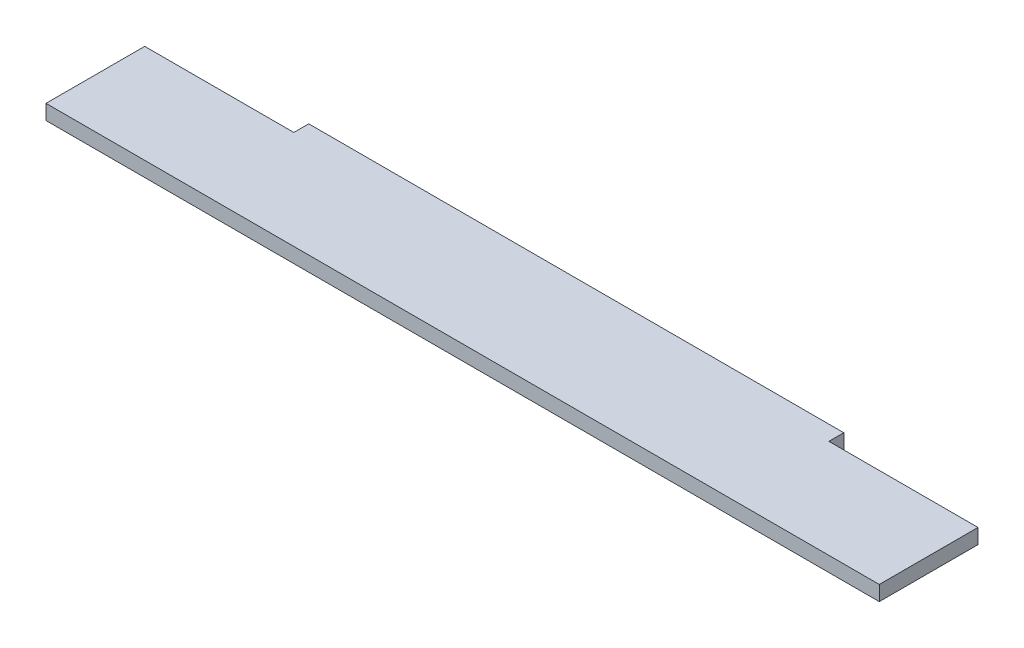
ISO-10303-21;
HEADER;
FILE_DESCRIPTION(('STEP AP214'),'2;1');
FILE_NAME('part.step','',(''),(''),'','','');
FILE_SCHEMA(('AUTOMOTIVE_DESIGN { 1 0 10303 214 1 1 1 1 }'));
ENDSEC;
DATA;
#1=APPLICATION_CONTEXT('core data for automotive mechanical design processes');
#2=APPLICATION_PROTOCOL_DEFINITION('international standard','automotive_design',2000,#1);
#3=PRODUCT_CONTEXT('',#1,'mechanical');
#4=PRODUCT('Part','Part','',(#3));
#5=PRODUCT_RELATED_PRODUCT_CATEGORY('part','',(#4));
#6=PRODUCT_DEFINITION_FORMATION('','',#4);
#7=PRODUCT_DEFINITION_CONTEXT('part definition',#1,'design');
#8=PRODUCT_DEFINITION('design','',#6,#7);
#9=PRODUCT_DEFINITION_SHAPE('','',#8);
#10=(LENGTH_UNIT() NAMED_UNIT(*) SI_UNIT(.MILLI.,.METRE.));
#11=(NAMED_UNIT(*) PLANE_ANGLE_UNIT() SI_UNIT($,.RADIAN.));
#12=(NAMED_UNIT(*) SI_UNIT($,.STERADIAN.) SOLID_ANGLE_UNIT());
#13=UNCERTAINTY_MEASURE_WITH_UNIT(LENGTH_MEASURE(1.E-05),#10,'distance_accuracy_value','');
#14=(GEOMETRIC_REPRESENTATION_CONTEXT(3) GLOBAL_UNCERTAINTY_ASSIGNED_CONTEXT((#13)) GLOBAL_UNIT_ASSIGNED_CONTEXT((#10,
#11,#12)) REPRESENTATION_CONTEXT('',''));
#15=CARTESIAN_POINT('',(0.,0.,0.));
#16=DIRECTION('',(0.,0.,1.));
#17=DIRECTION('',(1.,0.,0.));
#18=AXIS2_PLACEMENT_3D('',#15,#16,#17);
#19=CARTESIAN_POINT('',(139.7,5.,33.1));
#20=DIRECTION('',(0.,0.,-1.));
#21=DIRECTION('',(-1.,0.,0.));
#22=AXIS2_PLACEMENT_3D('',#19,#20,#21);
#23=PLANE('',#22);
#24=DIRECTION('',(1.,0.,0.));
#25=VECTOR('',#24,1.);
#26=CARTESIAN_POINT('',(139.7,0.,33.1));
#27=LINE('',#26,#25);
#28=CARTESIAN_POINT('',(-139.7,0.,33.1));
#29=VERTEX_POINT('',#28);
#30=CARTESIAN_POINT('',(139.7,0.,33.1));
#31=VERTEX_POINT('',#30);
#32=EDGE_CURVE('E140',#29,#31,#27,.T.);
#33=ORIENTED_EDGE('',*,*,#32,.T.);
#34=DIRECTION('',(0.,-1.,0.));
#35=VECTOR('',#34,1.);
#36=CARTESIAN_POINT('',(139.7,5.,33.1));
#37=LINE('',#36,#35);
#38=CARTESIAN_POINT('',(139.7,5.,33.1));
#39=VERTEX_POINT('',#38);
#40=EDGE_CURVE('E11',#39,#31,#37,.T.);
#41=ORIENTED_EDGE('',*,*,#40,.F.);
#42=DIRECTION('',(1.,0.,0.));
#43=VECTOR('',#42,1.);
#44=CARTESIAN_POINT('',(139.7,5.,33.1));
#45=LINE('',#44,#43);
#46=CARTESIAN_POINT('',(-139.7,5.,33.1));
#47=VERTEX_POINT('',#46);
#48=EDGE_CURVE('E162',#47,#39,#45,.T.);
#49=ORIENTED_EDGE('',*,*,#48,.F.);
#50=DIRECTION('',(0.,-1.,0.));
#51=VECTOR('',#50,1.);
#52=CARTESIAN_POINT('',(-139.7,5.,33.1));
#53=LINE('',#52,#51);
#54=EDGE_CURVE('E136',#47,#29,#53,.T.);
#55=ORIENTED_EDGE('',*,*,#54,.T.);
#56=EDGE_LOOP('',(#33,#41,#49,#55));
#57=FACE_BOUND('',#56,.T.);
#58=ADVANCED_FACE('F39',(#57),#23,.F.);
#59=CARTESIAN_POINT('',(139.7,5.,0.));
#60=DIRECTION('',(-1.,0.,0.));
#61=DIRECTION('',(0.,0.,1.));
#62=AXIS2_PLACEMENT_3D('',#59,#60,#61);
#63=PLANE('',#62);
#64=DIRECTION('',(0.,0.,-1.));
#65=VECTOR('',#64,1.);
#66=CARTESIAN_POINT('',(139.7,0.,0.));
#67=LINE('',#66,#65);
#68=CARTESIAN_POINT('',(139.7,0.,0.));
#69=VERTEX_POINT('',#68);
#70=EDGE_CURVE('E144',#31,#69,#67,.T.);
#71=ORIENTED_EDGE('',*,*,#70,.T.);
#72=DIRECTION('',(0.,-1.,0.));
#73=VECTOR('',#72,1.);
#74=CARTESIAN_POINT('',(139.7,5.,0.));
#75=LINE('',#74,#73);
#76=CARTESIAN_POINT('',(139.7,5.,0.));
#77=VERTEX_POINT('',#76);
#78=EDGE_CURVE('E48',#77,#69,#75,.T.);
#79=ORIENTED_EDGE('',*,*,#78,.F.);
#80=DIRECTION('',(0.,0.,-1.));
#81=VECTOR('',#80,1.);
#82=CARTESIAN_POINT('',(139.7,5.,0.));
#83=LINE('',#82,#81);
#84=EDGE_CURVE('E99',#39,#77,#83,.T.);
#85=ORIENTED_EDGE('',*,*,#84,.F.);
#86=ORIENTED_EDGE('',*,*,#40,.T.);
#87=EDGE_LOOP('',(#71,#79,#85,#86));
#88=FACE_BOUND('',#87,.T.);
#89=ADVANCED_FACE('F208',(#88),#63,.F.);
#90=CARTESIAN_POINT('',(89.6999999999999,5.,0.));
#91=DIRECTION('',(0.,0.,1.));
#92=DIRECTION('',(1.,0.,0.));
#93=AXIS2_PLACEMENT_3D('',#90,#91,#92);
#94=PLANE('',#93);
#95=DIRECTION('',(-1.,0.,0.));
#96=VECTOR('',#95,1.);
#97=CARTESIAN_POINT('',(89.6999999999999,0.,0.));
#98=LINE('',#97,#96);
#99=CARTESIAN_POINT('',(89.6999999999999,0.,0.));
#100=VERTEX_POINT('',#99);
#101=EDGE_CURVE('E147',#69,#100,#98,.T.);
#102=ORIENTED_EDGE('',*,*,#101,.T.);
#103=DIRECTION('',(0.,-1.,0.));
#104=VECTOR('',#103,1.);
#105=CARTESIAN_POINT('',(89.6999999999999,5.,0.));
#106=LINE('',#105,#104);
#107=CARTESIAN_POINT('',(89.6999999999999,5.,0.));
#108=VERTEX_POINT('',#107);
#109=EDGE_CURVE('E173',#108,#100,#106,.T.);
#110=ORIENTED_EDGE('',*,*,#109,.F.);
#111=DIRECTION('',(-1.,0.,0.));
#112=VECTOR('',#111,1.);
#113=CARTESIAN_POINT('',(89.6999999999999,5.,0.));
#114=LINE('',#113,#112);
#115=EDGE_CURVE('E183',#77,#108,#114,.T.);
#116=ORIENTED_EDGE('',*,*,#115,.F.);
#117=ORIENTED_EDGE('',*,*,#78,.T.);
#118=EDGE_LOOP('',(#102,#110,#116,#117));
#119=FACE_BOUND('',#118,.T.);
#120=ADVANCED_FACE('F181',(#119),#94,.F.);
#121=CARTESIAN_POINT('',(89.6999999999999,5.,-5.00000000000002));
#122=DIRECTION('',(-1.,0.,0.));
#123=DIRECTION('',(0.,0.,1.));
#124=AXIS2_PLACEMENT_3D('',#121,#122,#123);
#125=PLANE('',#124);
#126=DIRECTION('',(0.,0.,-1.));
#127=VECTOR('',#126,1.);
#128=CARTESIAN_POINT('',(89.6999999999999,0.,-5.00000000000002));
#129=LINE('',#128,#127);
#130=CARTESIAN_POINT('',(89.6999999999999,0.,-5.00000000000002));
#131=VERTEX_POINT('',#130);
#132=EDGE_CURVE('E150',#100,#131,#129,.T.);
#133=ORIENTED_EDGE('',*,*,#132,.T.);
#134=DIRECTION('',(0.,-1.,0.));
#135=VECTOR('',#134,1.);
#136=CARTESIAN_POINT('',(89.6999999999999,5.,-5.00000000000002));
#137=LINE('',#136,#135);
#138=CARTESIAN_POINT('',(89.6999999999999,5.,-5.00000000000002));
#139=VERTEX_POINT('',#138);
#140=EDGE_CURVE('E169',#139,#131,#137,.T.);
#141=ORIENTED_EDGE('',*,*,#140,.F.);
#142=DIRECTION('',(0.,0.,-1.));
#143=VECTOR('',#142,1.);
#144=CARTESIAN_POINT('',(89.6999999999999,5.,-5.00000000000002));
#145=LINE('',#144,#143);
#146=EDGE_CURVE('E196',#108,#139,#145,.T.);
#147=ORIENTED_EDGE('',*,*,#146,.F.);
#148=ORIENTED_EDGE('',*,*,#109,.T.);
#149=EDGE_LOOP('',(#133,#141,#147,#148));
#150=FACE_BOUND('',#149,.T.);
#151=ADVANCED_FACE('F191',(#150),#125,.F.);
#152=CARTESIAN_POINT('',(-89.6999999999999,5.,-5.));
#153=DIRECTION('',(0.,0.,1.));
#154=DIRECTION('',(1.,0.,0.));
#155=AXIS2_PLACEMENT_3D('',#152,#153,#154);
#156=PLANE('',#155);
#157=DIRECTION('',(-1.,0.,0.));
#158=VECTOR('',#157,1.);
#159=CARTESIAN_POINT('',(-89.6999999999999,0.,-5.));
#160=LINE('',#159,#158);
#161=CARTESIAN_POINT('',(-89.6999999999999,0.,-5.));
#162=VERTEX_POINT('',#161);
#163=EDGE_CURVE('E153',#131,#162,#160,.T.);
#164=ORIENTED_EDGE('',*,*,#163,.T.);
#165=DIRECTION('',(0.,-1.,0.));
#166=VECTOR('',#165,1.);
#167=CARTESIAN_POINT('',(-89.6999999999999,5.,-5.));
#168=LINE('',#167,#166);
#169=CARTESIAN_POINT('',(-89.6999999999999,5.,-5.));
#170=VERTEX_POINT('',#169);
#171=EDGE_CURVE('E129',#170,#162,#168,.T.);
#172=ORIENTED_EDGE('',*,*,#171,.F.);
#173=DIRECTION('',(-1.,0.,0.));
#174=VECTOR('',#173,1.);
#175=CARTESIAN_POINT('',(-89.6999999999999,5.,-5.));
#176=LINE('',#175,#174);
#177=EDGE_CURVE('E118',#139,#170,#176,.T.);
#178=ORIENTED_EDGE('',*,*,#177,.F.);
#179=ORIENTED_EDGE('',*,*,#140,.T.);
#180=EDGE_LOOP('',(#164,#172,#178,#179));
#181=FACE_BOUND('',#180,.T.);
#182=ADVANCED_FACE('F194',(#181),#156,.F.);
#183=CARTESIAN_POINT('',(-89.6999999999999,5.,0.));
#184=DIRECTION('',(1.,0.,0.));
#185=DIRECTION('',(0.,0.,-1.));
#186=AXIS2_PLACEMENT_3D('',#183,#184,#185);
#187=PLANE('',#186);
#188=DIRECTION('',(0.,0.,1.));
#189=VECTOR('',#188,1.);
#190=CARTESIAN_POINT('',(-89.6999999999999,0.,0.));
#191=LINE('',#190,#189);
#192=CARTESIAN_POINT('',(-89.6999999999999,0.,0.));
#193=VERTEX_POINT('',#192);
#194=EDGE_CURVE('E127',#162,#193,#191,.T.);
#195=ORIENTED_EDGE('',*,*,#194,.T.);
#196=DIRECTION('',(0.,-1.,0.));
#197=VECTOR('',#196,1.);
#198=CARTESIAN_POINT('',(-89.6999999999999,5.,0.));
#199=LINE('',#198,#197);
#200=CARTESIAN_POINT('',(-89.6999999999999,5.,0.));
#201=VERTEX_POINT('',#200);
#202=EDGE_CURVE('E124',#201,#193,#199,.T.);
#203=ORIENTED_EDGE('',*,*,#202,.F.);
#204=DIRECTION('',(0.,0.,1.));
#205=VECTOR('',#204,1.);
#206=CARTESIAN_POINT('',(-89.6999999999999,5.,0.));
#207=LINE('',#206,#205);
#208=EDGE_CURVE('E112',#170,#201,#207,.T.);
#209=ORIENTED_EDGE('',*,*,#208,.F.);
#210=ORIENTED_EDGE('',*,*,#171,.T.);
#211=EDGE_LOOP('',(#195,#203,#209,#210));
#212=FACE_BOUND('',#211,.T.);
#213=ADVANCED_FACE('F125',(#212),#187,.F.);
#214=CARTESIAN_POINT('',(-139.7,5.,0.));
#215=DIRECTION('',(0.,0.,1.));
#216=DIRECTION('',(1.,0.,0.));
#217=AXIS2_PLACEMENT_3D('',#214,#215,#216);
#218=PLANE('',#217);
#219=DIRECTION('',(-1.,0.,0.));
#220=VECTOR('',#219,1.);
#221=CARTESIAN_POINT('',(-139.7,0.,0.));
#222=LINE('',#221,#220);
#223=CARTESIAN_POINT('',(-139.7,0.,0.));
#224=VERTEX_POINT('',#223);
#225=EDGE_CURVE('E85',#193,#224,#222,.T.);
#226=ORIENTED_EDGE('',*,*,#225,.T.);
#227=DIRECTION('',(0.,-1.,0.));
#228=VECTOR('',#227,1.);
#229=CARTESIAN_POINT('',(-139.7,5.,0.));
#230=LINE('',#229,#228);
#231=CARTESIAN_POINT('',(-139.7,5.,0.));
#232=VERTEX_POINT('',#231);
#233=EDGE_CURVE('E130',#232,#224,#230,.T.);
#234=ORIENTED_EDGE('',*,*,#233,.F.);
#235=DIRECTION('',(-1.,0.,0.));
#236=VECTOR('',#235,1.);
#237=CARTESIAN_POINT('',(-139.7,5.,0.));
#238=LINE('',#237,#236);
#239=EDGE_CURVE('E116',#201,#232,#238,.T.);
#240=ORIENTED_EDGE('',*,*,#239,.F.);
#241=ORIENTED_EDGE('',*,*,#202,.T.);
#242=EDGE_LOOP('',(#226,#234,#240,#241));
#243=FACE_BOUND('',#242,.T.);
#244=ADVANCED_FACE('F132',(#243),#218,.F.);
#245=CARTESIAN_POINT('',(-139.7,5.,33.1));
#246=DIRECTION('',(1.,0.,0.));
#247=DIRECTION('',(0.,0.,-1.));
#248=AXIS2_PLACEMENT_3D('',#245,#246,#247);
#249=PLANE('',#248);
#250=DIRECTION('',(0.,0.,1.));
#251=VECTOR('',#250,1.);
#252=CARTESIAN_POINT('',(-139.7,0.,33.1));
#253=LINE('',#252,#251);
#254=EDGE_CURVE('E91',#224,#29,#253,.T.);
#255=ORIENTED_EDGE('',*,*,#254,.T.);
#256=ORIENTED_EDGE('',*,*,#54,.F.);
#257=DIRECTION('',(0.,0.,1.));
#258=VECTOR('',#257,1.);
#259=CARTESIAN_POINT('',(-139.7,5.,33.1));
#260=LINE('',#259,#258);
#261=EDGE_CURVE('E56',#232,#47,#260,.T.);
#262=ORIENTED_EDGE('',*,*,#261,.F.);
#263=ORIENTED_EDGE('',*,*,#233,.T.);
#264=EDGE_LOOP('',(#255,#256,#262,#263));
#265=FACE_BOUND('',#264,.T.);
#266=ADVANCED_FACE('F224',(#265),#249,.F.);
#267=CARTESIAN_POINT('',(0.,5.,0.));
#268=DIRECTION('',(0.,-1.,0.));
#269=DIRECTION('',(0.,0.,-1.));
#270=AXIS2_PLACEMENT_3D('',#267,#268,#269);
#271=PLANE('',#270);
#272=ORIENTED_EDGE('',*,*,#48,.T.);
#273=ORIENTED_EDGE('',*,*,#84,.T.);
#274=ORIENTED_EDGE('',*,*,#115,.T.);
#275=ORIENTED_EDGE('',*,*,#146,.T.);
#276=ORIENTED_EDGE('',*,*,#177,.T.);
#277=ORIENTED_EDGE('',*,*,#208,.T.);
#278=ORIENTED_EDGE('',*,*,#239,.T.);
#279=ORIENTED_EDGE('',*,*,#261,.T.);
#280=EDGE_LOOP('',(#272,#273,#274,#275,#276,#277,#278,#279));
#281=FACE_BOUND('',#280,.T.);
#282=ADVANCED_FACE('F114',(#281),#271,.F.);
#283=CARTESIAN_POINT('',(0.,0.,0.));
#284=DIRECTION('',(0.,-1.,0.));
#285=DIRECTION('',(0.,0.,-1.));
#286=AXIS2_PLACEMENT_3D('',#283,#284,#285);
#287=PLANE('',#286);
#288=ORIENTED_EDGE('',*,*,#32,.F.);
#289=ORIENTED_EDGE('',*,*,#254,.F.);
#290=ORIENTED_EDGE('',*,*,#225,.F.);
#291=ORIENTED_EDGE('',*,*,#194,.F.);
#292=ORIENTED_EDGE('',*,*,#163,.F.);
#293=ORIENTED_EDGE('',*,*,#132,.F.);
#294=ORIENTED_EDGE('',*,*,#101,.F.);
#295=ORIENTED_EDGE('',*,*,#70,.F.);
#296=EDGE_LOOP('',(#288,#289,#290,#291,#292,#293,#294,#295));
#297=FACE_BOUND('',#296,.T.);
#298=ADVANCED_FACE('F187',(#297),#287,.T.);
#299=CLOSED_SHELL('',(#58,#89,#120,#151,#182,#213,#244,#266,#282,#298));
#300=MANIFOLD_SOLID_BREP('B2',#299);
#301=ADVANCED_BREP_SHAPE_REPRESENTATION('',(#18,#300),#14);
#302=SHAPE_DEFINITION_REPRESENTATION(#9,#301);
ENDSEC;
END-ISO-10303-21;
